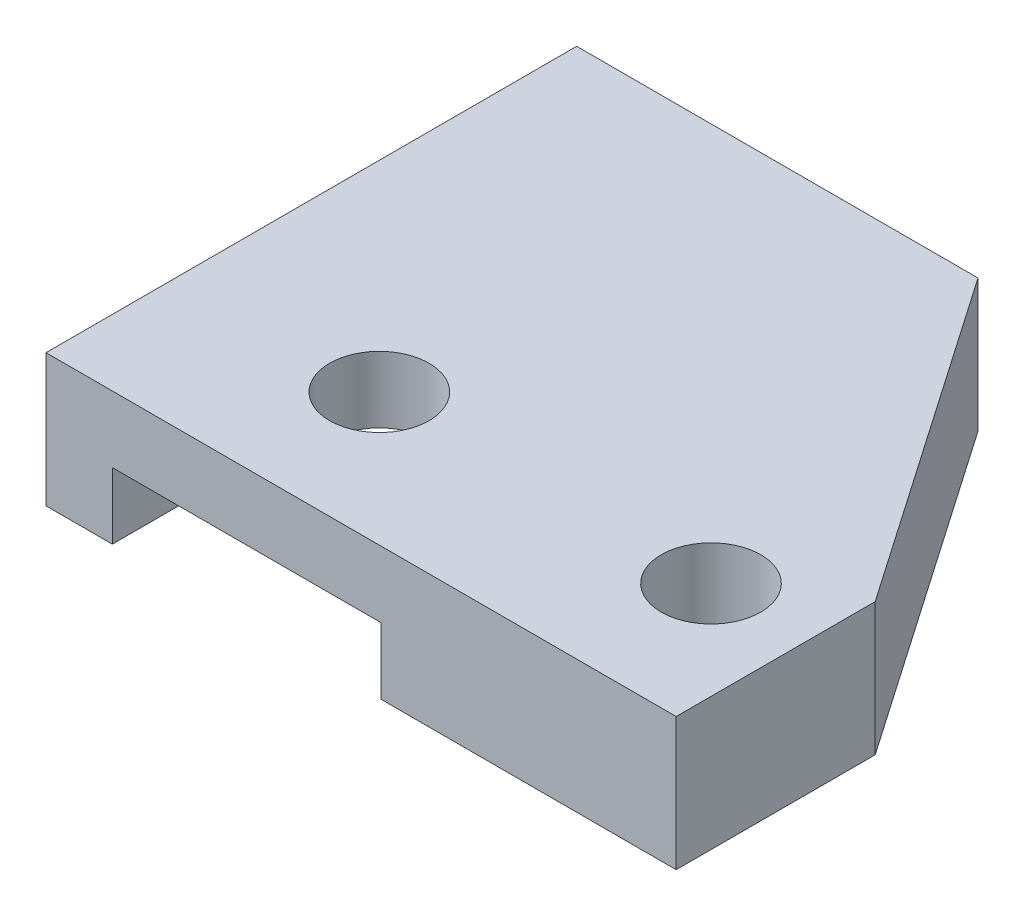
ISO-10303-21;
HEADER;
FILE_DESCRIPTION(('STEP AP214'),'2;1');
FILE_NAME('part.step','',(''),(''),'','','');
FILE_SCHEMA(('AUTOMOTIVE_DESIGN { 1 0 10303 214 1 1 1 1 }'));
ENDSEC;
DATA;
#1=APPLICATION_CONTEXT('core data for automotive mechanical design processes');
#2=APPLICATION_PROTOCOL_DEFINITION('international standard','automotive_design',2000,#1);
#3=PRODUCT_CONTEXT('',#1,'mechanical');
#4=PRODUCT('Part','Part','',(#3));
#5=PRODUCT_RELATED_PRODUCT_CATEGORY('part','',(#4));
#6=PRODUCT_DEFINITION_FORMATION('','',#4);
#7=PRODUCT_DEFINITION_CONTEXT('part definition',#1,'design');
#8=PRODUCT_DEFINITION('design','',#6,#7);
#9=PRODUCT_DEFINITION_SHAPE('','',#8);
#10=(LENGTH_UNIT() NAMED_UNIT(*) SI_UNIT(.MILLI.,.METRE.));
#11=(NAMED_UNIT(*) PLANE_ANGLE_UNIT() SI_UNIT($,.RADIAN.));
#12=(NAMED_UNIT(*) SI_UNIT($,.STERADIAN.) SOLID_ANGLE_UNIT());
#13=UNCERTAINTY_MEASURE_WITH_UNIT(LENGTH_MEASURE(1.E-05),#10,'distance_accuracy_value','');
#14=(GEOMETRIC_REPRESENTATION_CONTEXT(3) GLOBAL_UNCERTAINTY_ASSIGNED_CONTEXT((#13)) GLOBAL_UNIT_ASSIGNED_CONTEXT((#10,
#11,#12)) REPRESENTATION_CONTEXT('',''));
#15=CARTESIAN_POINT('',(0.,0.,0.));
#16=DIRECTION('',(0.,0.,1.));
#17=DIRECTION('',(1.,0.,0.));
#18=AXIS2_PLACEMENT_3D('',#15,#16,#17);
#19=CARTESIAN_POINT('',(0.,0.,16.));
#20=DIRECTION('',(1.,0.,0.));
#21=DIRECTION('',(0.,1.,0.));
#22=AXIS2_PLACEMENT_3D('',#19,#20,#21);
#23=PLANE('',#22);
#24=DIRECTION('',(0.,-1.,0.));
#25=VECTOR('',#24,1.);
#26=CARTESIAN_POINT('',(0.,0.,0.));
#27=LINE('',#26,#25);
#28=CARTESIAN_POINT('',(0.,0.,0.));
#29=VERTEX_POINT('',#28);
#30=CARTESIAN_POINT('',(0.,-4.,0.));
#31=VERTEX_POINT('',#30);
#32=EDGE_CURVE('E135',#29,#31,#27,.T.);
#33=ORIENTED_EDGE('',*,*,#32,.T.);
#34=DIRECTION('',(0.,0.,-1.));
#35=VECTOR('',#34,1.);
#36=CARTESIAN_POINT('',(0.,-4.,16.));
#37=LINE('',#36,#35);
#38=CARTESIAN_POINT('',(0.,-4.,16.));
#39=VERTEX_POINT('',#38);
#40=EDGE_CURVE('E11',#39,#31,#37,.T.);
#41=ORIENTED_EDGE('',*,*,#40,.F.);
#42=DIRECTION('',(0.,-1.,0.));
#43=VECTOR('',#42,1.);
#44=CARTESIAN_POINT('',(0.,0.,16.));
#45=LINE('',#44,#43);
#46=CARTESIAN_POINT('',(0.,0.,16.));
#47=VERTEX_POINT('',#46);
#48=EDGE_CURVE('E150',#47,#39,#45,.T.);
#49=ORIENTED_EDGE('',*,*,#48,.F.);
#50=DIRECTION('',(0.,0.,-1.));
#51=VECTOR('',#50,1.);
#52=CARTESIAN_POINT('',(0.,0.,16.));
#53=LINE('',#52,#51);
#54=EDGE_CURVE('E131',#47,#29,#53,.T.);
#55=ORIENTED_EDGE('',*,*,#54,.T.);
#56=EDGE_LOOP('',(#33,#41,#49,#55));
#57=FACE_BOUND('',#56,.T.);
#58=ADVANCED_FACE('F33',(#57),#23,.F.);
#59=CARTESIAN_POINT('',(0.,-4.,16.));
#60=DIRECTION('',(0.,1.,0.));
#61=DIRECTION('',(0.,0.,1.));
#62=AXIS2_PLACEMENT_3D('',#59,#60,#61);
#63=PLANE('',#62);
#64=DIRECTION('',(1.,0.,0.));
#65=VECTOR('',#64,1.);
#66=CARTESIAN_POINT('',(0.,-4.,0.));
#67=LINE('',#66,#65);
#68=CARTESIAN_POINT('',(2.,-4.,0.));
#69=VERTEX_POINT('',#68);
#70=EDGE_CURVE('E138',#31,#69,#67,.T.);
#71=ORIENTED_EDGE('',*,*,#70,.T.);
#72=DIRECTION('',(0.,0.,-1.));
#73=VECTOR('',#72,1.);
#74=CARTESIAN_POINT('',(2.,-4.,16.));
#75=LINE('',#74,#73);
#76=CARTESIAN_POINT('',(2.,-4.,16.));
#77=VERTEX_POINT('',#76);
#78=EDGE_CURVE('E40',#77,#69,#75,.T.);
#79=ORIENTED_EDGE('',*,*,#78,.F.);
#80=DIRECTION('',(1.,0.,0.));
#81=VECTOR('',#80,1.);
#82=CARTESIAN_POINT('',(0.,-4.,16.));
#83=LINE('',#82,#81);
#84=EDGE_CURVE('E91',#39,#77,#83,.T.);
#85=ORIENTED_EDGE('',*,*,#84,.F.);
#86=ORIENTED_EDGE('',*,*,#40,.T.);
#87=EDGE_LOOP('',(#71,#79,#85,#86));
#88=FACE_BOUND('',#87,.T.);
#89=ADVANCED_FACE('F208',(#88),#63,.F.);
#90=CARTESIAN_POINT('',(2.,-4.,16.));
#91=DIRECTION('',(-1.,0.,0.));
#92=DIRECTION('',(0.,0.,1.));
#93=AXIS2_PLACEMENT_3D('',#90,#91,#92);
#94=PLANE('',#93);
#95=DIRECTION('',(0.,1.,0.));
#96=VECTOR('',#95,1.);
#97=CARTESIAN_POINT('',(2.,-4.,0.));
#98=LINE('',#97,#96);
#99=CARTESIAN_POINT('',(2.,-2.,0.));
#100=VERTEX_POINT('',#99);
#101=EDGE_CURVE('E141',#69,#100,#98,.T.);
#102=ORIENTED_EDGE('',*,*,#101,.T.);
#103=DIRECTION('',(0.,0.,-1.));
#104=VECTOR('',#103,1.);
#105=CARTESIAN_POINT('',(2.,-2.,16.));
#106=LINE('',#105,#104);
#107=CARTESIAN_POINT('',(2.,-2.,16.));
#108=VERTEX_POINT('',#107);
#109=EDGE_CURVE('E157',#108,#100,#106,.T.);
#110=ORIENTED_EDGE('',*,*,#109,.F.);
#111=DIRECTION('',(0.,1.,0.));
#112=VECTOR('',#111,1.);
#113=CARTESIAN_POINT('',(2.,-4.,16.));
#114=LINE('',#113,#112);
#115=EDGE_CURVE('E165',#77,#108,#114,.T.);
#116=ORIENTED_EDGE('',*,*,#115,.F.);
#117=ORIENTED_EDGE('',*,*,#78,.T.);
#118=EDGE_LOOP('',(#102,#110,#116,#117));
#119=FACE_BOUND('',#118,.T.);
#120=ADVANCED_FACE('F163',(#119),#94,.F.);
#121=CARTESIAN_POINT('',(2.,-2.,16.));
#122=DIRECTION('',(0.,1.,0.));
#123=DIRECTION('',(0.,0.,1.));
#124=AXIS2_PLACEMENT_3D('',#121,#122,#123);
#125=PLANE('',#124);
#126=CARTESIAN_POINT('',(6.05,-2.,12.));
#127=DIRECTION('',(0.,1.,0.));
#128=DIRECTION('',(0.,0.,1.));
#129=AXIS2_PLACEMENT_3D('',#126,#127,#128);
#130=CIRCLE('',#129,1.5);
#131=CARTESIAN_POINT('',(6.05,-2.,13.5));
#132=VERTEX_POINT('',#131);
#133=EDGE_CURVE('E139',#132,#132,#130,.T.);
#134=ORIENTED_EDGE('',*,*,#133,.T.);
#135=EDGE_LOOP('',(#134));
#136=FACE_BOUND('',#135,.T.);
#137=DIRECTION('',(1.,0.,0.));
#138=VECTOR('',#137,1.);
#139=CARTESIAN_POINT('',(2.,-2.,0.));
#140=LINE('',#139,#138);
#141=CARTESIAN_POINT('',(10.1,-2.,0.));
#142=VERTEX_POINT('',#141);
#143=EDGE_CURVE('E143',#100,#142,#140,.T.);
#144=ORIENTED_EDGE('',*,*,#143,.T.);
#145=DIRECTION('',(0.,0.,-1.));
#146=VECTOR('',#145,1.);
#147=CARTESIAN_POINT('',(10.1,-2.,16.));
#148=LINE('',#147,#146);
#149=CARTESIAN_POINT('',(10.1,-2.,16.));
#150=VERTEX_POINT('',#149);
#151=EDGE_CURVE('E154',#150,#142,#148,.T.);
#152=ORIENTED_EDGE('',*,*,#151,.F.);
#153=DIRECTION('',(1.,0.,0.));
#154=VECTOR('',#153,1.);
#155=CARTESIAN_POINT('',(2.,-2.,16.));
#156=LINE('',#155,#154);
#157=EDGE_CURVE('E178',#108,#150,#156,.T.);
#158=ORIENTED_EDGE('',*,*,#157,.F.);
#159=ORIENTED_EDGE('',*,*,#109,.T.);
#160=EDGE_LOOP('',(#144,#152,#158,#159));
#161=FACE_BOUND('',#160,.T.);
#162=ADVANCED_FACE('F174',(#136,#161),#125,.F.);
#163=CARTESIAN_POINT('',(10.1,-4.,16.));
#164=DIRECTION('',(1.,0.,0.));
#165=DIRECTION('',(0.,0.,-1.));
#166=AXIS2_PLACEMENT_3D('',#163,#164,#165);
#167=PLANE('',#166);
#168=DIRECTION('',(0.,-1.,0.));
#169=VECTOR('',#168,1.);
#170=CARTESIAN_POINT('',(10.1,-4.,0.));
#171=LINE('',#170,#169);
#172=CARTESIAN_POINT('',(10.1,-4.,0.));
#173=VERTEX_POINT('',#172);
#174=EDGE_CURVE('E145',#142,#173,#171,.T.);
#175=ORIENTED_EDGE('',*,*,#174,.T.);
#176=DIRECTION('',(0.,0.,-1.));
#177=VECTOR('',#176,1.);
#178=CARTESIAN_POINT('',(10.1,-4.,16.));
#179=LINE('',#178,#177);
#180=CARTESIAN_POINT('',(10.1,-4.,16.));
#181=VERTEX_POINT('',#180);
#182=EDGE_CURVE('E125',#181,#173,#179,.T.);
#183=ORIENTED_EDGE('',*,*,#182,.F.);
#184=DIRECTION('',(0.,-1.,0.));
#185=VECTOR('',#184,1.);
#186=CARTESIAN_POINT('',(10.1,-4.,16.));
#187=LINE('',#186,#185);
#188=EDGE_CURVE('E114',#150,#181,#187,.T.);
#189=ORIENTED_EDGE('',*,*,#188,.F.);
#190=ORIENTED_EDGE('',*,*,#151,.T.);
#191=EDGE_LOOP('',(#175,#183,#189,#190));
#192=FACE_BOUND('',#191,.T.);
#193=ADVANCED_FACE('F177',(#192),#167,.F.);
#194=CARTESIAN_POINT('',(10.1,-4.,16.));
#195=DIRECTION('',(0.,1.,0.));
#196=DIRECTION('',(0.,0.,1.));
#197=AXIS2_PLACEMENT_3D('',#194,#195,#196);
#198=PLANE('',#197);
#199=CARTESIAN_POINT('',(16.05,-4.,12.));
#200=DIRECTION('',(0.,1.,0.));
#201=DIRECTION('',(0.,0.,1.));
#202=AXIS2_PLACEMENT_3D('',#199,#200,#201);
#203=CIRCLE('',#202,1.5);
#204=CARTESIAN_POINT('',(16.05,-4.,13.5));
#205=VERTEX_POINT('',#204);
#206=EDGE_CURVE('E189',#205,#205,#203,.T.);
#207=ORIENTED_EDGE('',*,*,#206,.T.);
#208=EDGE_LOOP('',(#207));
#209=FACE_BOUND('',#208,.T.);
#210=DIRECTION('',(1.,0.,0.));
#211=VECTOR('',#210,1.);
#212=CARTESIAN_POINT('',(10.1,-4.,0.));
#213=LINE('',#212,#211);
#214=CARTESIAN_POINT('',(12.1,-4.,0.));
#215=VERTEX_POINT('',#214);
#216=EDGE_CURVE('E147',#173,#215,#213,.T.);
#217=ORIENTED_EDGE('',*,*,#216,.T.);
#218=DIRECTION('',(0.567925279738123,0.,0.823080115562498));
#219=VECTOR('',#218,1.);
#220=CARTESIAN_POINT('',(19.,-4.,10.));
#221=LINE('',#220,#219);
#222=CARTESIAN_POINT('',(19.,-4.,10.));
#223=VERTEX_POINT('',#222);
#224=EDGE_CURVE('E47',#215,#223,#221,.T.);
#225=ORIENTED_EDGE('',*,*,#224,.T.);
#226=DIRECTION('',(0.,0.,-1.));
#227=VECTOR('',#226,1.);
#228=CARTESIAN_POINT('',(19.,-4.,16.));
#229=LINE('',#228,#227);
#230=CARTESIAN_POINT('',(19.,-4.,16.));
#231=VERTEX_POINT('',#230);
#232=EDGE_CURVE('E120',#231,#223,#229,.T.);
#233=ORIENTED_EDGE('',*,*,#232,.F.);
#234=DIRECTION('',(1.,0.,0.));
#235=VECTOR('',#234,1.);
#236=CARTESIAN_POINT('',(10.1,-4.,16.));
#237=LINE('',#236,#235);
#238=EDGE_CURVE('E107',#181,#231,#237,.T.);
#239=ORIENTED_EDGE('',*,*,#238,.F.);
#240=ORIENTED_EDGE('',*,*,#182,.T.);
#241=EDGE_LOOP('',(#217,#225,#233,#239,#240));
#242=FACE_BOUND('',#241,.T.);
#243=ADVANCED_FACE('F122',(#209,#242),#198,.F.);
#244=CARTESIAN_POINT('',(19.,0.,16.));
#245=DIRECTION('',(-1.,0.,0.));
#246=DIRECTION('',(0.,0.,1.));
#247=AXIS2_PLACEMENT_3D('',#244,#245,#246);
#248=PLANE('',#247);
#249=ORIENTED_EDGE('',*,*,#232,.T.);
#250=DIRECTION('',(0.,1.,0.));
#251=VECTOR('',#250,1.);
#252=CARTESIAN_POINT('',(19.,-4.,10.));
#253=LINE('',#252,#251);
#254=CARTESIAN_POINT('',(19.,0.,10.));
#255=VERTEX_POINT('',#254);
#256=EDGE_CURVE('E196',#223,#255,#253,.T.);
#257=ORIENTED_EDGE('',*,*,#256,.T.);
#258=DIRECTION('',(0.,0.,-1.));
#259=VECTOR('',#258,1.);
#260=CARTESIAN_POINT('',(19.,0.,16.));
#261=LINE('',#260,#259);
#262=CARTESIAN_POINT('',(19.,0.,16.));
#263=VERTEX_POINT('',#262);
#264=EDGE_CURVE('E126',#263,#255,#261,.T.);
#265=ORIENTED_EDGE('',*,*,#264,.F.);
#266=DIRECTION('',(0.,1.,0.));
#267=VECTOR('',#266,1.);
#268=CARTESIAN_POINT('',(19.,0.,16.));
#269=LINE('',#268,#267);
#270=EDGE_CURVE('E111',#231,#263,#269,.T.);
#271=ORIENTED_EDGE('',*,*,#270,.F.);
#272=EDGE_LOOP('',(#249,#257,#265,#271));
#273=FACE_BOUND('',#272,.T.);
#274=ADVANCED_FACE('F128',(#273),#248,.F.);
#275=CARTESIAN_POINT('',(0.,0.,16.));
#276=DIRECTION('',(0.,-1.,0.));
#277=DIRECTION('',(0.,0.,-1.));
#278=AXIS2_PLACEMENT_3D('',#275,#276,#277);
#279=PLANE('',#278);
#280=CARTESIAN_POINT('',(16.05,0.,12.));
#281=DIRECTION('',(0.,1.,0.));
#282=DIRECTION('',(0.,0.,1.));
#283=AXIS2_PLACEMENT_3D('',#280,#281,#282);
#284=CIRCLE('',#283,1.5);
#285=CARTESIAN_POINT('',(16.05,0.,13.5));
#286=VERTEX_POINT('',#285);
#287=EDGE_CURVE('E190',#286,#286,#284,.T.);
#288=ORIENTED_EDGE('',*,*,#287,.F.);
#289=EDGE_LOOP('',(#288));
#290=FACE_BOUND('',#289,.T.);
#291=CARTESIAN_POINT('',(6.05,0.,12.));
#292=DIRECTION('',(0.,1.,0.));
#293=DIRECTION('',(0.,0.,1.));
#294=AXIS2_PLACEMENT_3D('',#291,#292,#293);
#295=CIRCLE('',#294,1.5);
#296=CARTESIAN_POINT('',(6.05,0.,13.5));
#297=VERTEX_POINT('',#296);
#298=EDGE_CURVE('E186',#297,#297,#295,.T.);
#299=ORIENTED_EDGE('',*,*,#298,.F.);
#300=EDGE_LOOP('',(#299));
#301=FACE_BOUND('',#300,.T.);
#302=ORIENTED_EDGE('',*,*,#264,.T.);
#303=DIRECTION('',(0.567925279738123,0.,0.823080115562498));
#304=VECTOR('',#303,1.);
#305=CARTESIAN_POINT('',(19.,0.,10.));
#306=LINE('',#305,#304);
#307=CARTESIAN_POINT('',(12.1,0.,0.));
#308=VERTEX_POINT('',#307);
#309=EDGE_CURVE('E199',#308,#255,#306,.T.);
#310=ORIENTED_EDGE('',*,*,#309,.F.);
#311=DIRECTION('',(-1.,0.,0.));
#312=VECTOR('',#311,1.);
#313=CARTESIAN_POINT('',(0.,0.,0.));
#314=LINE('',#313,#312);
#315=EDGE_CURVE('E83',#308,#29,#314,.T.);
#316=ORIENTED_EDGE('',*,*,#315,.T.);
#317=ORIENTED_EDGE('',*,*,#54,.F.);
#318=DIRECTION('',(-1.,0.,0.));
#319=VECTOR('',#318,1.);
#320=CARTESIAN_POINT('',(0.,0.,16.));
#321=LINE('',#320,#319);
#322=EDGE_CURVE('E56',#263,#47,#321,.T.);
#323=ORIENTED_EDGE('',*,*,#322,.F.);
#324=EDGE_LOOP('',(#302,#310,#316,#317,#323));
#325=FACE_BOUND('',#324,.T.);
#326=ADVANCED_FACE('F204',(#290,#301,#325),#279,.F.);
#327=CARTESIAN_POINT('',(0.,0.,16.));
#328=DIRECTION('',(0.,0.,1.));
#329=DIRECTION('',(1.,0.,0.));
#330=AXIS2_PLACEMENT_3D('',#327,#328,#329);
#331=PLANE('',#330);
#332=ORIENTED_EDGE('',*,*,#48,.T.);
#333=ORIENTED_EDGE('',*,*,#84,.T.);
#334=ORIENTED_EDGE('',*,*,#115,.T.);
#335=ORIENTED_EDGE('',*,*,#157,.T.);
#336=ORIENTED_EDGE('',*,*,#188,.T.);
#337=ORIENTED_EDGE('',*,*,#238,.T.);
#338=ORIENTED_EDGE('',*,*,#270,.T.);
#339=ORIENTED_EDGE('',*,*,#322,.T.);
#340=EDGE_LOOP('',(#332,#333,#334,#335,#336,#337,#338,#339));
#341=FACE_BOUND('',#340,.T.);
#342=ADVANCED_FACE('F109',(#341),#331,.T.);
#343=CARTESIAN_POINT('',(0.,0.,0.));
#344=DIRECTION('',(0.,0.,1.));
#345=DIRECTION('',(1.,0.,0.));
#346=AXIS2_PLACEMENT_3D('',#343,#344,#345);
#347=PLANE('',#346);
#348=ORIENTED_EDGE('',*,*,#315,.F.);
#349=DIRECTION('',(0.,1.,0.));
#350=VECTOR('',#349,1.);
#351=CARTESIAN_POINT('',(12.1,-4.,0.));
#352=LINE('',#351,#350);
#353=EDGE_CURVE('E193',#215,#308,#352,.T.);
#354=ORIENTED_EDGE('',*,*,#353,.F.);
#355=ORIENTED_EDGE('',*,*,#216,.F.);
#356=ORIENTED_EDGE('',*,*,#174,.F.);
#357=ORIENTED_EDGE('',*,*,#143,.F.);
#358=ORIENTED_EDGE('',*,*,#101,.F.);
#359=ORIENTED_EDGE('',*,*,#70,.F.);
#360=ORIENTED_EDGE('',*,*,#32,.F.);
#361=EDGE_LOOP('',(#348,#354,#355,#356,#357,#358,#359,#360));
#362=FACE_BOUND('',#361,.T.);
#363=ADVANCED_FACE('F168',(#362),#347,.F.);
#364=CARTESIAN_POINT('',(6.05,-4.,12.));
#365=DIRECTION('',(0.,1.,0.));
#366=DIRECTION('',(0.,0.,1.));
#367=AXIS2_PLACEMENT_3D('',#364,#365,#366);
#368=CYLINDRICAL_SURFACE('',#367,1.5);
#369=ORIENTED_EDGE('',*,*,#298,.T.);
#370=EDGE_LOOP('',(#369));
#371=FACE_BOUND('',#370,.T.);
#372=ORIENTED_EDGE('',*,*,#133,.F.);
#373=EDGE_LOOP('',(#372));
#374=FACE_BOUND('',#373,.T.);
#375=ADVANCED_FACE('F231',(#371,#374),#368,.F.);
#376=CARTESIAN_POINT('',(16.05,-4.,12.));
#377=DIRECTION('',(0.,1.,0.));
#378=DIRECTION('',(0.,0.,1.));
#379=AXIS2_PLACEMENT_3D('',#376,#377,#378);
#380=CYLINDRICAL_SURFACE('',#379,1.5);
#381=ORIENTED_EDGE('',*,*,#206,.F.);
#382=EDGE_LOOP('',(#381));
#383=FACE_BOUND('',#382,.T.);
#384=ORIENTED_EDGE('',*,*,#287,.T.);
#385=EDGE_LOOP('',(#384));
#386=FACE_BOUND('',#385,.T.);
#387=ADVANCED_FACE('F236',(#383,#386),#380,.F.);
#388=CARTESIAN_POINT('',(19.,-4.,10.));
#389=DIRECTION('',(-0.823080115562497,0.,0.567925279738123));
#390=DIRECTION('',(0.567925279738123,0.,0.823080115562498));
#391=AXIS2_PLACEMENT_3D('',#388,#389,#390);
#392=PLANE('',#391);
#393=ORIENTED_EDGE('',*,*,#309,.T.);
#394=ORIENTED_EDGE('',*,*,#256,.F.);
#395=ORIENTED_EDGE('',*,*,#224,.F.);
#396=ORIENTED_EDGE('',*,*,#353,.T.);
#397=EDGE_LOOP('',(#393,#394,#395,#396));
#398=FACE_BOUND('',#397,.T.);
#399=ADVANCED_FACE('F203',(#398),#392,.F.);
#400=CLOSED_SHELL('',(#58,#89,#120,#162,#193,#243,#274,#326,#342,#363,#375,#387,#399));
#401=MANIFOLD_SOLID_BREP('B2',#400);
#402=ADVANCED_BREP_SHAPE_REPRESENTATION('',(#18,#401),#14);
#403=SHAPE_DEFINITION_REPRESENTATION(#9,#402);
ENDSEC;
END-ISO-10303-21;
